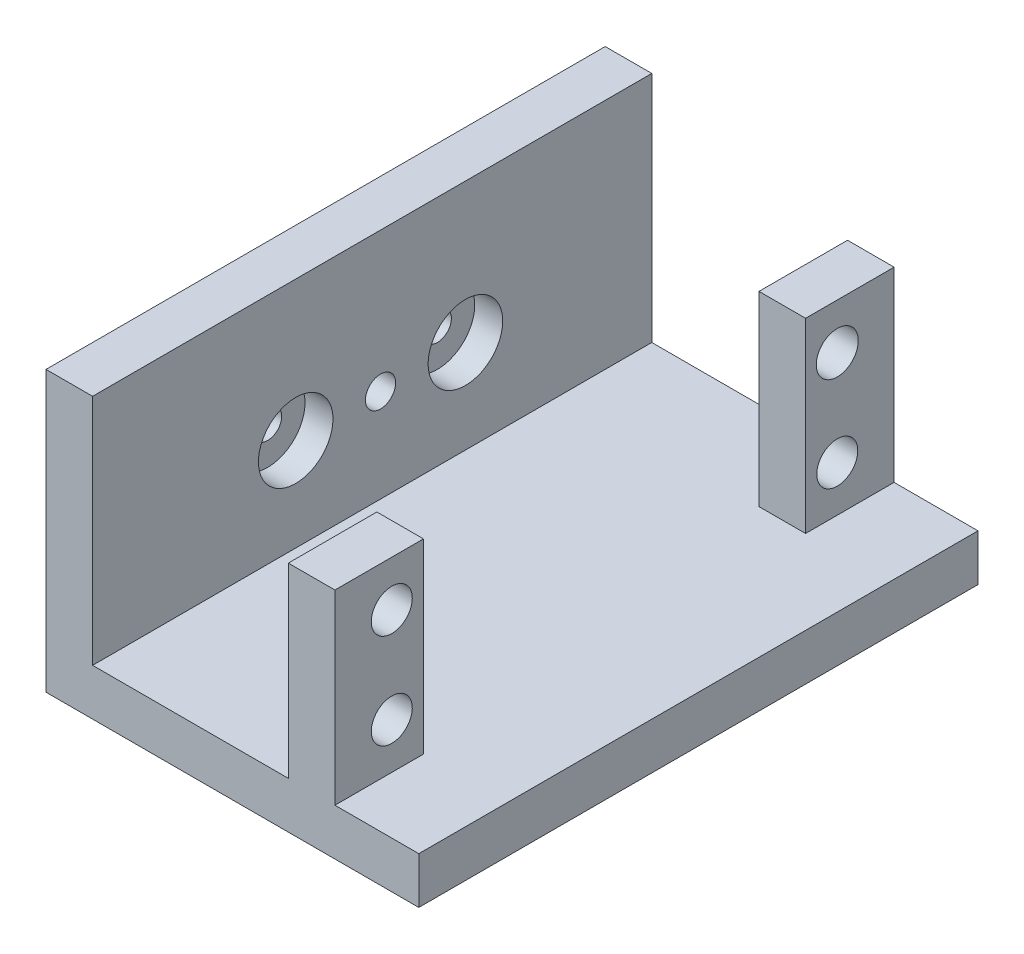
ISO-10303-21;
HEADER;
FILE_DESCRIPTION(('STEP AP214'),'2;1');
FILE_NAME('part.step','',(''),(''),'','','');
FILE_SCHEMA(('AUTOMOTIVE_DESIGN { 1 0 10303 214 1 1 1 1 }'));
ENDSEC;
DATA;
#1=APPLICATION_CONTEXT('core data for automotive mechanical design processes');
#2=APPLICATION_PROTOCOL_DEFINITION('international standard','automotive_design',2000,#1);
#3=PRODUCT_CONTEXT('',#1,'mechanical');
#4=PRODUCT('Part','Part','',(#3));
#5=PRODUCT_RELATED_PRODUCT_CATEGORY('part','',(#4));
#6=PRODUCT_DEFINITION_FORMATION('','',#4);
#7=PRODUCT_DEFINITION_CONTEXT('part definition',#1,'design');
#8=PRODUCT_DEFINITION('design','',#6,#7);
#9=PRODUCT_DEFINITION_SHAPE('','',#8);
#10=(LENGTH_UNIT() NAMED_UNIT(*) SI_UNIT(.MILLI.,.METRE.));
#11=(NAMED_UNIT(*) PLANE_ANGLE_UNIT() SI_UNIT($,.RADIAN.));
#12=(NAMED_UNIT(*) SI_UNIT($,.STERADIAN.) SOLID_ANGLE_UNIT());
#13=UNCERTAINTY_MEASURE_WITH_UNIT(LENGTH_MEASURE(1.E-05),#10,'distance_accuracy_value','');
#14=(GEOMETRIC_REPRESENTATION_CONTEXT(3) GLOBAL_UNCERTAINTY_ASSIGNED_CONTEXT((#13)) GLOBAL_UNIT_ASSIGNED_CONTEXT((#10,
#11,#12)) REPRESENTATION_CONTEXT('',''));
#15=CARTESIAN_POINT('',(0.,0.,0.));
#16=DIRECTION('',(0.,0.,1.));
#17=DIRECTION('',(1.,0.,0.));
#18=AXIS2_PLACEMENT_3D('',#15,#16,#17);
#19=CARTESIAN_POINT('',(10.,15.0000000000001,38.2089961386937));
#20=DIRECTION('',(-1.,0.,0.));
#21=DIRECTION('',(0.,-1.,0.));
#22=AXIS2_PLACEMENT_3D('',#19,#20,#21);
#23=CYLINDRICAL_SURFACE('',#22,1.5);
#24=CARTESIAN_POINT('',(0.,15.0000000000001,38.2089961386937));
#25=DIRECTION('',(-1.,0.,0.));
#26=DIRECTION('',(0.,-1.,0.));
#27=AXIS2_PLACEMENT_3D('',#24,#25,#26);
#28=CIRCLE('',#27,1.5);
#29=CARTESIAN_POINT('',(0.,13.5,38.2089961386937));
#30=VERTEX_POINT('',#29);
#31=EDGE_CURVE('E219',#30,#30,#28,.T.);
#32=ORIENTED_EDGE('',*,*,#31,.T.);
#33=EDGE_LOOP('',(#32));
#34=FACE_BOUND('',#33,.T.);
#35=CARTESIAN_POINT('',(2.,15.0000000000001,38.2089961386937));
#36=DIRECTION('',(1.,0.,0.));
#37=DIRECTION('',(0.,1.,0.));
#38=AXIS2_PLACEMENT_3D('',#35,#36,#37);
#39=CIRCLE('',#38,1.5);
#40=CARTESIAN_POINT('',(2.,16.5000000000001,38.2089961386937));
#41=VERTEX_POINT('',#40);
#42=EDGE_CURVE('E221',#41,#41,#39,.F.);
#43=ORIENTED_EDGE('',*,*,#42,.F.);
#44=EDGE_LOOP('',(#43));
#45=FACE_BOUND('',#44,.T.);
#46=ADVANCED_FACE('F33',(#34,#45),#23,.F.);
#47=CARTESIAN_POINT('',(10.,15.0000000000001,20.));
#48=DIRECTION('',(-1.,0.,0.));
#49=DIRECTION('',(0.,-1.,0.));
#50=AXIS2_PLACEMENT_3D('',#47,#48,#49);
#51=CYLINDRICAL_SURFACE('',#50,1.5);
#52=CARTESIAN_POINT('',(0.,15.0000000000001,20.));
#53=DIRECTION('',(-1.,0.,0.));
#54=DIRECTION('',(0.,-1.,0.));
#55=AXIS2_PLACEMENT_3D('',#52,#53,#54);
#56=CIRCLE('',#55,1.5);
#57=CARTESIAN_POINT('',(0.,13.5000000000001,20.));
#58=VERTEX_POINT('',#57);
#59=EDGE_CURVE('E243',#58,#58,#56,.T.);
#60=ORIENTED_EDGE('',*,*,#59,.T.);
#61=EDGE_LOOP('',(#60));
#62=FACE_BOUND('',#61,.T.);
#63=CARTESIAN_POINT('',(2.,15.0000000000001,20.));
#64=DIRECTION('',(1.,0.,0.));
#65=DIRECTION('',(0.,1.,0.));
#66=AXIS2_PLACEMENT_3D('',#63,#64,#65);
#67=CIRCLE('',#66,1.5);
#68=CARTESIAN_POINT('',(2.,16.5000000000001,20.));
#69=VERTEX_POINT('',#68);
#70=EDGE_CURVE('E217',#69,#69,#67,.F.);
#71=ORIENTED_EDGE('',*,*,#70,.F.);
#72=EDGE_LOOP('',(#71));
#73=FACE_BOUND('',#72,.T.);
#74=ADVANCED_FACE('F349',(#62,#73),#51,.F.);
#75=CARTESIAN_POINT('',(31.,25.,60.));
#76=DIRECTION('',(-1.,0.,0.));
#77=DIRECTION('',(0.,-1.,0.));
#78=AXIS2_PLACEMENT_3D('',#75,#76,#77);
#79=PLANE('',#78);
#80=CARTESIAN_POINT('',(31.,20.1,6.09999999999999));
#81=DIRECTION('',(1.,0.,0.));
#82=DIRECTION('',(0.,1.,0.));
#83=AXIS2_PLACEMENT_3D('',#80,#81,#82);
#84=CIRCLE('',#83,2.25352460703334);
#85=CARTESIAN_POINT('',(31.,22.3535246070334,6.09999999999999));
#86=VERTEX_POINT('',#85);
#87=EDGE_CURVE('E216',#86,#86,#84,.T.);
#88=ORIENTED_EDGE('',*,*,#87,.F.);
#89=EDGE_LOOP('',(#88));
#90=FACE_BOUND('',#89,.T.);
#91=CARTESIAN_POINT('',(31.,9.90000000000002,6.09999999999999));
#92=DIRECTION('',(1.,0.,0.));
#93=DIRECTION('',(0.,1.,0.));
#94=AXIS2_PLACEMENT_3D('',#91,#92,#93);
#95=CIRCLE('',#94,2.20000000000001);
#96=CARTESIAN_POINT('',(31.,12.1,6.09999999999999));
#97=VERTEX_POINT('',#96);
#98=EDGE_CURVE('E212',#97,#97,#95,.T.);
#99=ORIENTED_EDGE('',*,*,#98,.F.);
#100=EDGE_LOOP('',(#99));
#101=FACE_BOUND('',#100,.T.);
#102=DIRECTION('',(0.,0.,-1.));
#103=VECTOR('',#102,1.);
#104=CARTESIAN_POINT('',(31.,25.,60.));
#105=LINE('',#104,#103);
#106=CARTESIAN_POINT('',(31.,25.,9.5));
#107=VERTEX_POINT('',#106);
#108=CARTESIAN_POINT('',(31.,25.,0.));
#109=VERTEX_POINT('',#108);
#110=EDGE_CURVE('E187',#107,#109,#105,.T.);
#111=ORIENTED_EDGE('',*,*,#110,.F.);
#112=DIRECTION('',(0.,1.,0.));
#113=VECTOR('',#112,1.);
#114=CARTESIAN_POINT('',(31.,-36.3037528561268,9.5));
#115=LINE('',#114,#113);
#116=CARTESIAN_POINT('',(31.,5.,9.5));
#117=VERTEX_POINT('',#116);
#118=EDGE_CURVE('E158',#117,#107,#115,.T.);
#119=ORIENTED_EDGE('',*,*,#118,.F.);
#120=DIRECTION('',(0.,0.,-1.));
#121=VECTOR('',#120,1.);
#122=CARTESIAN_POINT('',(31.,5.,60.));
#123=LINE('',#122,#121);
#124=CARTESIAN_POINT('',(31.,5.,0.));
#125=VERTEX_POINT('',#124);
#126=EDGE_CURVE('E191',#117,#125,#123,.T.);
#127=ORIENTED_EDGE('',*,*,#126,.T.);
#128=DIRECTION('',(0.,1.,0.));
#129=VECTOR('',#128,1.);
#130=CARTESIAN_POINT('',(31.,25.,0.));
#131=LINE('',#130,#129);
#132=EDGE_CURVE('E165',#125,#109,#131,.T.);
#133=ORIENTED_EDGE('',*,*,#132,.T.);
#134=EDGE_LOOP('',(#111,#119,#127,#133));
#135=FACE_BOUND('',#134,.T.);
#136=ADVANCED_FACE('F325',(#90,#101,#135),#79,.F.);
#137=CARTESIAN_POINT('',(26.,25.,60.));
#138=DIRECTION('',(0.,-1.,0.));
#139=DIRECTION('',(0.,0.,-1.));
#140=AXIS2_PLACEMENT_3D('',#137,#138,#139);
#141=PLANE('',#140);
#142=DIRECTION('',(0.,0.,-1.));
#143=VECTOR('',#142,1.);
#144=CARTESIAN_POINT('',(26.,25.,60.));
#145=LINE('',#144,#143);
#146=CARTESIAN_POINT('',(26.,25.,9.5));
#147=VERTEX_POINT('',#146);
#148=CARTESIAN_POINT('',(26.,25.,0.));
#149=VERTEX_POINT('',#148);
#150=EDGE_CURVE('E183',#147,#149,#145,.T.);
#151=ORIENTED_EDGE('',*,*,#150,.F.);
#152=DIRECTION('',(-1.,0.,0.));
#153=VECTOR('',#152,1.);
#154=CARTESIAN_POINT('',(31.,25.,9.5));
#155=LINE('',#154,#153);
#156=EDGE_CURVE('E203',#107,#147,#155,.T.);
#157=ORIENTED_EDGE('',*,*,#156,.F.);
#158=ORIENTED_EDGE('',*,*,#110,.T.);
#159=DIRECTION('',(-1.,0.,0.));
#160=VECTOR('',#159,1.);
#161=CARTESIAN_POINT('',(26.,25.,0.));
#162=LINE('',#161,#160);
#163=EDGE_CURVE('E168',#109,#149,#162,.T.);
#164=ORIENTED_EDGE('',*,*,#163,.T.);
#165=EDGE_LOOP('',(#151,#157,#158,#164));
#166=FACE_BOUND('',#165,.T.);
#167=ADVANCED_FACE('F331',(#166),#141,.F.);
#168=CARTESIAN_POINT('',(26.,5.,60.));
#169=DIRECTION('',(1.,0.,0.));
#170=DIRECTION('',(0.,0.,-1.));
#171=AXIS2_PLACEMENT_3D('',#168,#169,#170);
#172=PLANE('',#171);
#173=CARTESIAN_POINT('',(26.,20.1,6.09999999999999));
#174=DIRECTION('',(1.,0.,0.));
#175=DIRECTION('',(0.,0.,-1.));
#176=AXIS2_PLACEMENT_3D('',#173,#174,#175);
#177=CIRCLE('',#176,2.25352460703334);
#178=CARTESIAN_POINT('',(26.,20.1,3.84647539296665));
#179=VERTEX_POINT('',#178);
#180=EDGE_CURVE('E213',#179,#179,#177,.T.);
#181=ORIENTED_EDGE('',*,*,#180,.T.);
#182=EDGE_LOOP('',(#181));
#183=FACE_BOUND('',#182,.T.);
#184=CARTESIAN_POINT('',(26.,9.90000000000002,6.09999999999999));
#185=DIRECTION('',(1.,0.,0.));
#186=DIRECTION('',(0.,0.,-1.));
#187=AXIS2_PLACEMENT_3D('',#184,#185,#186);
#188=CIRCLE('',#187,2.20000000000001);
#189=CARTESIAN_POINT('',(26.,9.90000000000002,3.89999999999999));
#190=VERTEX_POINT('',#189);
#191=EDGE_CURVE('E209',#190,#190,#188,.T.);
#192=ORIENTED_EDGE('',*,*,#191,.T.);
#193=EDGE_LOOP('',(#192));
#194=FACE_BOUND('',#193,.T.);
#195=DIRECTION('',(0.,0.,-1.));
#196=VECTOR('',#195,1.);
#197=CARTESIAN_POINT('',(26.,5.,60.));
#198=LINE('',#197,#196);
#199=CARTESIAN_POINT('',(26.,5.,9.5));
#200=VERTEX_POINT('',#199);
#201=CARTESIAN_POINT('',(26.,5.,0.));
#202=VERTEX_POINT('',#201);
#203=EDGE_CURVE('E145',#200,#202,#198,.T.);
#204=ORIENTED_EDGE('',*,*,#203,.F.);
#205=DIRECTION('',(0.,1.,0.));
#206=VECTOR('',#205,1.);
#207=CARTESIAN_POINT('',(26.,-36.3037528561268,9.5));
#208=LINE('',#207,#206);
#209=EDGE_CURVE('E260',#200,#147,#208,.T.);
#210=ORIENTED_EDGE('',*,*,#209,.T.);
#211=ORIENTED_EDGE('',*,*,#150,.T.);
#212=DIRECTION('',(0.,-1.,0.));
#213=VECTOR('',#212,1.);
#214=CARTESIAN_POINT('',(26.,5.,0.));
#215=LINE('',#214,#213);
#216=EDGE_CURVE('E171',#149,#202,#215,.T.);
#217=ORIENTED_EDGE('',*,*,#216,.T.);
#218=EDGE_LOOP('',(#204,#210,#211,#217));
#219=FACE_BOUND('',#218,.T.);
#220=ADVANCED_FACE('F335',(#183,#194,#219),#172,.F.);
#221=CARTESIAN_POINT('',(0.,30.,60.));
#222=DIRECTION('',(1.,0.,0.));
#223=DIRECTION('',(0.,1.,0.));
#224=AXIS2_PLACEMENT_3D('',#221,#222,#223);
#225=PLANE('',#224);
#226=CARTESIAN_POINT('',(0.,15.0000000000001,29.1044980693468));
#227=DIRECTION('',(1.,0.,0.));
#228=DIRECTION('',(0.,1.,0.));
#229=AXIS2_PLACEMENT_3D('',#226,#227,#228);
#230=CIRCLE('',#229,1.62131480529386);
#231=CARTESIAN_POINT('',(0.,16.6213148052939,29.1044980693468));
#232=VERTEX_POINT('',#231);
#233=EDGE_CURVE('E37',#232,#232,#230,.T.);
#234=ORIENTED_EDGE('',*,*,#233,.T.);
#235=EDGE_LOOP('',(#234));
#236=FACE_BOUND('',#235,.T.);
#237=ORIENTED_EDGE('',*,*,#31,.F.);
#238=EDGE_LOOP('',(#237));
#239=FACE_BOUND('',#238,.T.);
#240=ORIENTED_EDGE('',*,*,#59,.F.);
#241=EDGE_LOOP('',(#240));
#242=FACE_BOUND('',#241,.T.);
#243=DIRECTION('',(0.,-1.,0.));
#244=VECTOR('',#243,1.);
#245=CARTESIAN_POINT('',(0.,30.,0.));
#246=LINE('',#245,#244);
#247=CARTESIAN_POINT('',(0.,30.,0.));
#248=VERTEX_POINT('',#247);
#249=CARTESIAN_POINT('',(0.,0.,0.));
#250=VERTEX_POINT('',#249);
#251=EDGE_CURVE('E154',#248,#250,#246,.T.);
#252=ORIENTED_EDGE('',*,*,#251,.T.);
#253=DIRECTION('',(0.,0.,-1.));
#254=VECTOR('',#253,1.);
#255=CARTESIAN_POINT('',(0.,0.,60.));
#256=LINE('',#255,#254);
#257=CARTESIAN_POINT('',(0.,0.,60.));
#258=VERTEX_POINT('',#257);
#259=EDGE_CURVE('E11',#258,#250,#256,.T.);
#260=ORIENTED_EDGE('',*,*,#259,.F.);
#261=DIRECTION('',(0.,-1.,0.));
#262=VECTOR('',#261,1.);
#263=CARTESIAN_POINT('',(0.,30.,60.));
#264=LINE('',#263,#262);
#265=CARTESIAN_POINT('',(0.,30.,60.));
#266=VERTEX_POINT('',#265);
#267=EDGE_CURVE('E178',#266,#258,#264,.T.);
#268=ORIENTED_EDGE('',*,*,#267,.F.);
#269=DIRECTION('',(0.,0.,-1.));
#270=VECTOR('',#269,1.);
#271=CARTESIAN_POINT('',(0.,30.,60.));
#272=LINE('',#271,#270);
#273=EDGE_CURVE('E150',#266,#248,#272,.T.);
#274=ORIENTED_EDGE('',*,*,#273,.T.);
#275=EDGE_LOOP('',(#252,#260,#268,#274));
#276=FACE_BOUND('',#275,.T.);
#277=ADVANCED_FACE('F35',(#236,#239,#242,#276),#225,.F.);
#278=CARTESIAN_POINT('',(0.,0.,60.));
#279=DIRECTION('',(0.,1.,0.));
#280=DIRECTION('',(0.,0.,1.));
#281=AXIS2_PLACEMENT_3D('',#278,#279,#280);
#282=PLANE('',#281);
#283=DIRECTION('',(1.,0.,0.));
#284=VECTOR('',#283,1.);
#285=CARTESIAN_POINT('',(0.,0.,0.));
#286=LINE('',#285,#284);
#287=CARTESIAN_POINT('',(40.,0.,0.));
#288=VERTEX_POINT('',#287);
#289=EDGE_CURVE('E157',#250,#288,#286,.T.);
#290=ORIENTED_EDGE('',*,*,#289,.T.);
#291=DIRECTION('',(0.,0.,-1.));
#292=VECTOR('',#291,1.);
#293=CARTESIAN_POINT('',(40.,0.,60.));
#294=LINE('',#293,#292);
#295=CARTESIAN_POINT('',(40.,0.,60.));
#296=VERTEX_POINT('',#295);
#297=EDGE_CURVE('E42',#296,#288,#294,.T.);
#298=ORIENTED_EDGE('',*,*,#297,.F.);
#299=DIRECTION('',(1.,0.,0.));
#300=VECTOR('',#299,1.);
#301=CARTESIAN_POINT('',(0.,0.,60.));
#302=LINE('',#301,#300);
#303=EDGE_CURVE('E105',#258,#296,#302,.T.);
#304=ORIENTED_EDGE('',*,*,#303,.F.);
#305=ORIENTED_EDGE('',*,*,#259,.T.);
#306=EDGE_LOOP('',(#290,#298,#304,#305));
#307=FACE_BOUND('',#306,.T.);
#308=ADVANCED_FACE('F340',(#307),#282,.F.);
#309=CARTESIAN_POINT('',(40.,0.,60.));
#310=DIRECTION('',(-1.,0.,0.));
#311=DIRECTION('',(0.,0.,1.));
#312=AXIS2_PLACEMENT_3D('',#309,#310,#311);
#313=PLANE('',#312);
#314=DIRECTION('',(0.,1.,0.));
#315=VECTOR('',#314,1.);
#316=CARTESIAN_POINT('',(40.,0.,0.));
#317=LINE('',#316,#315);
#318=CARTESIAN_POINT('',(40.,5.,0.));
#319=VERTEX_POINT('',#318);
#320=EDGE_CURVE('E160',#288,#319,#317,.T.);
#321=ORIENTED_EDGE('',*,*,#320,.T.);
#322=DIRECTION('',(0.,0.,-1.));
#323=VECTOR('',#322,1.);
#324=CARTESIAN_POINT('',(40.,5.,60.));
#325=LINE('',#324,#323);
#326=CARTESIAN_POINT('',(40.,5.,60.));
#327=VERTEX_POINT('',#326);
#328=EDGE_CURVE('E195',#327,#319,#325,.T.);
#329=ORIENTED_EDGE('',*,*,#328,.F.);
#330=DIRECTION('',(0.,1.,0.));
#331=VECTOR('',#330,1.);
#332=CARTESIAN_POINT('',(40.,0.,60.));
#333=LINE('',#332,#331);
#334=EDGE_CURVE('E276',#296,#327,#333,.T.);
#335=ORIENTED_EDGE('',*,*,#334,.F.);
#336=ORIENTED_EDGE('',*,*,#297,.T.);
#337=EDGE_LOOP('',(#321,#329,#335,#336));
#338=FACE_BOUND('',#337,.T.);
#339=ADVANCED_FACE('F315',(#338),#313,.F.);
#340=CARTESIAN_POINT('',(31.,9.90000000000002,53.9));
#341=DIRECTION('',(1.,0.,0.));
#342=DIRECTION('',(0.,1.,0.));
#343=AXIS2_PLACEMENT_3D('',#340,#341,#342);
#344=CIRCLE('',#343,2.20000000000001);
#345=CARTESIAN_POINT('',(31.,12.1,53.9));
#346=VERTEX_POINT('',#345);
#347=EDGE_CURVE('E208',#346,#346,#344,.T.);
#348=ORIENTED_EDGE('',*,*,#347,.F.);
#349=EDGE_LOOP('',(#348));
#350=FACE_BOUND('',#349,.T.);
#351=CARTESIAN_POINT('',(31.,20.1,53.9));
#352=DIRECTION('',(1.,0.,0.));
#353=DIRECTION('',(0.,1.,0.));
#354=AXIS2_PLACEMENT_3D('',#351,#352,#353);
#355=CIRCLE('',#354,2.20000000000001);
#356=CARTESIAN_POINT('',(31.,22.3,53.9));
#357=VERTEX_POINT('',#356);
#358=EDGE_CURVE('E204',#357,#357,#355,.T.);
#359=ORIENTED_EDGE('',*,*,#358,.F.);
#360=EDGE_LOOP('',(#359));
#361=FACE_BOUND('',#360,.T.);
#362=CARTESIAN_POINT('',(31.,5.,60.));
#363=VERTEX_POINT('',#362);
#364=CARTESIAN_POINT('',(31.,5.,50.5));
#365=VERTEX_POINT('',#364);
#366=EDGE_CURVE('E192',#363,#365,#123,.T.);
#367=ORIENTED_EDGE('',*,*,#366,.T.);
#368=DIRECTION('',(0.,1.,0.));
#369=VECTOR('',#368,1.);
#370=CARTESIAN_POINT('',(31.,-36.3037528561268,50.5));
#371=LINE('',#370,#369);
#372=CARTESIAN_POINT('',(31.,25.,50.5));
#373=VERTEX_POINT('',#372);
#374=EDGE_CURVE('E264',#365,#373,#371,.T.);
#375=ORIENTED_EDGE('',*,*,#374,.T.);
#376=CARTESIAN_POINT('',(31.,25.,60.));
#377=VERTEX_POINT('',#376);
#378=EDGE_CURVE('E188',#377,#373,#105,.T.);
#379=ORIENTED_EDGE('',*,*,#378,.F.);
#380=DIRECTION('',(0.,1.,0.));
#381=VECTOR('',#380,1.);
#382=CARTESIAN_POINT('',(31.,25.,60.));
#383=LINE('',#382,#381);
#384=EDGE_CURVE('E280',#363,#377,#383,.T.);
#385=ORIENTED_EDGE('',*,*,#384,.F.);
#386=EDGE_LOOP('',(#367,#375,#379,#385));
#387=FACE_BOUND('',#386,.T.);
#388=ADVANCED_FACE('F309',(#350,#361,#387),#79,.F.);
#389=ORIENTED_EDGE('',*,*,#378,.T.);
#390=DIRECTION('',(1.,0.,0.));
#391=VECTOR('',#390,1.);
#392=CARTESIAN_POINT('',(31.,25.,50.5));
#393=LINE('',#392,#391);
#394=CARTESIAN_POINT('',(26.,25.,50.5));
#395=VERTEX_POINT('',#394);
#396=EDGE_CURVE('E254',#395,#373,#393,.T.);
#397=ORIENTED_EDGE('',*,*,#396,.F.);
#398=CARTESIAN_POINT('',(26.,25.,60.));
#399=VERTEX_POINT('',#398);
#400=EDGE_CURVE('E184',#399,#395,#145,.T.);
#401=ORIENTED_EDGE('',*,*,#400,.F.);
#402=DIRECTION('',(-1.,0.,0.));
#403=VECTOR('',#402,1.);
#404=CARTESIAN_POINT('',(26.,25.,60.));
#405=LINE('',#404,#403);
#406=EDGE_CURVE('E282',#377,#399,#405,.T.);
#407=ORIENTED_EDGE('',*,*,#406,.F.);
#408=EDGE_LOOP('',(#389,#397,#401,#407));
#409=FACE_BOUND('',#408,.T.);
#410=ADVANCED_FACE('F289',(#409),#141,.F.);
#411=CARTESIAN_POINT('',(26.,9.90000000000002,53.9));
#412=DIRECTION('',(1.,0.,0.));
#413=DIRECTION('',(0.,0.,-1.));
#414=AXIS2_PLACEMENT_3D('',#411,#412,#413);
#415=CIRCLE('',#414,2.20000000000001);
#416=CARTESIAN_POINT('',(26.,9.90000000000002,51.7));
#417=VERTEX_POINT('',#416);
#418=EDGE_CURVE('E205',#417,#417,#415,.T.);
#419=ORIENTED_EDGE('',*,*,#418,.T.);
#420=EDGE_LOOP('',(#419));
#421=FACE_BOUND('',#420,.T.);
#422=CARTESIAN_POINT('',(26.,20.1,53.9));
#423=DIRECTION('',(1.,0.,0.));
#424=DIRECTION('',(0.,0.,-1.));
#425=AXIS2_PLACEMENT_3D('',#422,#423,#424);
#426=CIRCLE('',#425,2.20000000000001);
#427=CARTESIAN_POINT('',(26.,20.1,51.7));
#428=VERTEX_POINT('',#427);
#429=EDGE_CURVE('E200',#428,#428,#426,.T.);
#430=ORIENTED_EDGE('',*,*,#429,.T.);
#431=EDGE_LOOP('',(#430));
#432=FACE_BOUND('',#431,.T.);
#433=ORIENTED_EDGE('',*,*,#400,.T.);
#434=DIRECTION('',(0.,1.,0.));
#435=VECTOR('',#434,1.);
#436=CARTESIAN_POINT('',(26.,-36.3037528561268,50.5));
#437=LINE('',#436,#435);
#438=CARTESIAN_POINT('',(26.,5.,50.5));
#439=VERTEX_POINT('',#438);
#440=EDGE_CURVE('E265',#439,#395,#437,.T.);
#441=ORIENTED_EDGE('',*,*,#440,.F.);
#442=CARTESIAN_POINT('',(26.,5.,60.));
#443=VERTEX_POINT('',#442);
#444=EDGE_CURVE('E181',#443,#439,#198,.T.);
#445=ORIENTED_EDGE('',*,*,#444,.F.);
#446=DIRECTION('',(0.,-1.,0.));
#447=VECTOR('',#446,1.);
#448=CARTESIAN_POINT('',(26.,5.,60.));
#449=LINE('',#448,#447);
#450=EDGE_CURVE('E134',#399,#443,#449,.T.);
#451=ORIENTED_EDGE('',*,*,#450,.F.);
#452=EDGE_LOOP('',(#433,#441,#445,#451));
#453=FACE_BOUND('',#452,.T.);
#454=ADVANCED_FACE('F293',(#421,#432,#453),#172,.F.);
#455=CARTESIAN_POINT('',(26.,5.,60.));
#456=DIRECTION('',(0.,-1.,0.));
#457=DIRECTION('',(1.,0.,0.));
#458=AXIS2_PLACEMENT_3D('',#455,#456,#457);
#459=PLANE('',#458);
#460=DIRECTION('',(-1.,0.,0.));
#461=VECTOR('',#460,1.);
#462=CARTESIAN_POINT('',(26.,5.,0.));
#463=LINE('',#462,#461);
#464=CARTESIAN_POINT('',(5.,4.99999999999999,0.));
#465=VERTEX_POINT('',#464);
#466=EDGE_CURVE('E142',#202,#465,#463,.T.);
#467=ORIENTED_EDGE('',*,*,#466,.T.);
#468=DIRECTION('',(0.,0.,-1.));
#469=VECTOR('',#468,1.);
#470=CARTESIAN_POINT('',(5.,4.99999999999999,60.));
#471=LINE('',#470,#469);
#472=CARTESIAN_POINT('',(5.,4.99999999999999,60.));
#473=VERTEX_POINT('',#472);
#474=EDGE_CURVE('E139',#473,#465,#471,.T.);
#475=ORIENTED_EDGE('',*,*,#474,.F.);
#476=DIRECTION('',(-1.,0.,0.));
#477=VECTOR('',#476,1.);
#478=CARTESIAN_POINT('',(26.,5.,60.));
#479=LINE('',#478,#477);
#480=EDGE_CURVE('E127',#443,#473,#479,.T.);
#481=ORIENTED_EDGE('',*,*,#480,.F.);
#482=ORIENTED_EDGE('',*,*,#444,.T.);
#483=DIRECTION('',(1.,0.,0.));
#484=VECTOR('',#483,1.);
#485=CARTESIAN_POINT('',(31.,5.,50.5));
#486=LINE('',#485,#484);
#487=EDGE_CURVE('E261',#439,#365,#486,.T.);
#488=ORIENTED_EDGE('',*,*,#487,.T.);
#489=ORIENTED_EDGE('',*,*,#366,.F.);
#490=DIRECTION('',(-1.,0.,0.));
#491=VECTOR('',#490,1.);
#492=CARTESIAN_POINT('',(40.,5.,60.));
#493=LINE('',#492,#491);
#494=EDGE_CURVE('E278',#327,#363,#493,.T.);
#495=ORIENTED_EDGE('',*,*,#494,.F.);
#496=ORIENTED_EDGE('',*,*,#328,.T.);
#497=DIRECTION('',(-1.,0.,0.));
#498=VECTOR('',#497,1.);
#499=CARTESIAN_POINT('',(40.,5.,0.));
#500=LINE('',#499,#498);
#501=EDGE_CURVE('E162',#319,#125,#500,.T.);
#502=ORIENTED_EDGE('',*,*,#501,.T.);
#503=ORIENTED_EDGE('',*,*,#126,.F.);
#504=DIRECTION('',(-1.,0.,0.));
#505=VECTOR('',#504,1.);
#506=CARTESIAN_POINT('',(31.,5.,9.5));
#507=LINE('',#506,#505);
#508=EDGE_CURVE('E50',#117,#200,#507,.T.);
#509=ORIENTED_EDGE('',*,*,#508,.T.);
#510=ORIENTED_EDGE('',*,*,#203,.T.);
#511=EDGE_LOOP('',(#467,#475,#481,#482,#488,#489,#495,#496,#502,#503,#509,#510));
#512=FACE_BOUND('',#511,.T.);
#513=ADVANCED_FACE('F140',(#512),#459,.F.);
#514=CARTESIAN_POINT('',(5.,4.99999999999999,60.));
#515=DIRECTION('',(-1.,0.,0.));
#516=DIRECTION('',(0.,-1.,0.));
#517=AXIS2_PLACEMENT_3D('',#514,#515,#516);
#518=PLANE('',#517);
#519=CARTESIAN_POINT('',(5.,15.0000000000001,29.1044980693468));
#520=DIRECTION('',(1.,0.,0.));
#521=DIRECTION('',(0.,1.,0.));
#522=AXIS2_PLACEMENT_3D('',#519,#520,#521);
#523=CIRCLE('',#522,1.62131480529386);
#524=CARTESIAN_POINT('',(5.,16.6213148052939,29.1044980693468));
#525=VERTEX_POINT('',#524);
#526=EDGE_CURVE('E235',#525,#525,#523,.T.);
#527=ORIENTED_EDGE('',*,*,#526,.F.);
#528=EDGE_LOOP('',(#527));
#529=FACE_BOUND('',#528,.T.);
#530=CARTESIAN_POINT('',(5.,15.0000000000001,38.2089961386937));
#531=DIRECTION('',(1.,0.,0.));
#532=DIRECTION('',(0.,1.,0.));
#533=AXIS2_PLACEMENT_3D('',#530,#531,#532);
#534=CIRCLE('',#533,4.);
#535=CARTESIAN_POINT('',(5.,19.0000000000001,38.2089961386937));
#536=VERTEX_POINT('',#535);
#537=EDGE_CURVE('E230',#536,#536,#534,.T.);
#538=ORIENTED_EDGE('',*,*,#537,.F.);
#539=EDGE_LOOP('',(#538));
#540=FACE_BOUND('',#539,.T.);
#541=CARTESIAN_POINT('',(5.,15.0000000000001,20.));
#542=DIRECTION('',(1.,0.,0.));
#543=DIRECTION('',(0.,1.,0.));
#544=AXIS2_PLACEMENT_3D('',#541,#542,#543);
#545=CIRCLE('',#544,4.);
#546=CARTESIAN_POINT('',(5.,19.0000000000001,20.));
#547=VERTEX_POINT('',#546);
#548=EDGE_CURVE('E223',#547,#547,#545,.T.);
#549=ORIENTED_EDGE('',*,*,#548,.F.);
#550=EDGE_LOOP('',(#549));
#551=FACE_BOUND('',#550,.T.);
#552=DIRECTION('',(0.,1.,0.));
#553=VECTOR('',#552,1.);
#554=CARTESIAN_POINT('',(5.,4.99999999999999,0.));
#555=LINE('',#554,#553);
#556=CARTESIAN_POINT('',(5.,30.,0.));
#557=VERTEX_POINT('',#556);
#558=EDGE_CURVE('E175',#465,#557,#555,.T.);
#559=ORIENTED_EDGE('',*,*,#558,.T.);
#560=DIRECTION('',(0.,0.,-1.));
#561=VECTOR('',#560,1.);
#562=CARTESIAN_POINT('',(5.,30.,60.));
#563=LINE('',#562,#561);
#564=CARTESIAN_POINT('',(5.,30.,60.));
#565=VERTEX_POINT('',#564);
#566=EDGE_CURVE('E146',#565,#557,#563,.T.);
#567=ORIENTED_EDGE('',*,*,#566,.F.);
#568=DIRECTION('',(0.,1.,0.));
#569=VECTOR('',#568,1.);
#570=CARTESIAN_POINT('',(5.,4.99999999999999,60.));
#571=LINE('',#570,#569);
#572=EDGE_CURVE('E131',#473,#565,#571,.T.);
#573=ORIENTED_EDGE('',*,*,#572,.F.);
#574=ORIENTED_EDGE('',*,*,#474,.T.);
#575=EDGE_LOOP('',(#559,#567,#573,#574));
#576=FACE_BOUND('',#575,.T.);
#577=ADVANCED_FACE('F148',(#529,#540,#551,#576),#518,.F.);
#578=CARTESIAN_POINT('',(5.,30.,60.));
#579=DIRECTION('',(0.,-1.,0.));
#580=DIRECTION('',(0.,0.,-1.));
#581=AXIS2_PLACEMENT_3D('',#578,#579,#580);
#582=PLANE('',#581);
#583=DIRECTION('',(-1.,0.,0.));
#584=VECTOR('',#583,1.);
#585=CARTESIAN_POINT('',(5.,30.,0.));
#586=LINE('',#585,#584);
#587=EDGE_CURVE('E97',#557,#248,#586,.T.);
#588=ORIENTED_EDGE('',*,*,#587,.T.);
#589=ORIENTED_EDGE('',*,*,#273,.F.);
#590=DIRECTION('',(-1.,0.,0.));
#591=VECTOR('',#590,1.);
#592=CARTESIAN_POINT('',(5.,30.,60.));
#593=LINE('',#592,#591);
#594=EDGE_CURVE('E59',#565,#266,#593,.T.);
#595=ORIENTED_EDGE('',*,*,#594,.F.);
#596=ORIENTED_EDGE('',*,*,#566,.T.);
#597=EDGE_LOOP('',(#588,#589,#595,#596));
#598=FACE_BOUND('',#597,.T.);
#599=ADVANCED_FACE('F336',(#598),#582,.F.);
#600=CARTESIAN_POINT('',(0.,0.,60.));
#601=DIRECTION('',(0.,0.,1.));
#602=DIRECTION('',(1.,0.,0.));
#603=AXIS2_PLACEMENT_3D('',#600,#601,#602);
#604=PLANE('',#603);
#605=ORIENTED_EDGE('',*,*,#267,.T.);
#606=ORIENTED_EDGE('',*,*,#303,.T.);
#607=ORIENTED_EDGE('',*,*,#334,.T.);
#608=ORIENTED_EDGE('',*,*,#494,.T.);
#609=ORIENTED_EDGE('',*,*,#384,.T.);
#610=ORIENTED_EDGE('',*,*,#406,.T.);
#611=ORIENTED_EDGE('',*,*,#450,.T.);
#612=ORIENTED_EDGE('',*,*,#480,.T.);
#613=ORIENTED_EDGE('',*,*,#572,.T.);
#614=ORIENTED_EDGE('',*,*,#594,.T.);
#615=EDGE_LOOP('',(#605,#606,#607,#608,#609,#610,#611,#612,#613,#614));
#616=FACE_BOUND('',#615,.T.);
#617=ADVANCED_FACE('F129',(#616),#604,.T.);
#618=CARTESIAN_POINT('',(0.,0.,0.));
#619=DIRECTION('',(0.,0.,1.));
#620=DIRECTION('',(1.,0.,0.));
#621=AXIS2_PLACEMENT_3D('',#618,#619,#620);
#622=PLANE('',#621);
#623=ORIENTED_EDGE('',*,*,#251,.F.);
#624=ORIENTED_EDGE('',*,*,#587,.F.);
#625=ORIENTED_EDGE('',*,*,#558,.F.);
#626=ORIENTED_EDGE('',*,*,#466,.F.);
#627=ORIENTED_EDGE('',*,*,#216,.F.);
#628=ORIENTED_EDGE('',*,*,#163,.F.);
#629=ORIENTED_EDGE('',*,*,#132,.F.);
#630=ORIENTED_EDGE('',*,*,#501,.F.);
#631=ORIENTED_EDGE('',*,*,#320,.F.);
#632=ORIENTED_EDGE('',*,*,#289,.F.);
#633=EDGE_LOOP('',(#623,#624,#625,#626,#627,#628,#629,#630,#631,#632));
#634=FACE_BOUND('',#633,.T.);
#635=ADVANCED_FACE('F319',(#634),#622,.F.);
#636=CARTESIAN_POINT('',(31.,-36.3037528561268,9.5));
#637=DIRECTION('',(0.,0.,-1.));
#638=DIRECTION('',(-1.,0.,0.));
#639=AXIS2_PLACEMENT_3D('',#636,#637,#638);
#640=PLANE('',#639);
#641=ORIENTED_EDGE('',*,*,#118,.T.);
#642=ORIENTED_EDGE('',*,*,#156,.T.);
#643=ORIENTED_EDGE('',*,*,#209,.F.);
#644=ORIENTED_EDGE('',*,*,#508,.F.);
#645=EDGE_LOOP('',(#641,#642,#643,#644));
#646=FACE_BOUND('',#645,.T.);
#647=ADVANCED_FACE('F328',(#646),#640,.F.);
#648=CARTESIAN_POINT('',(31.,-36.3037528561268,50.5));
#649=DIRECTION('',(0.,0.,1.));
#650=DIRECTION('',(1.,0.,0.));
#651=AXIS2_PLACEMENT_3D('',#648,#649,#650);
#652=PLANE('',#651);
#653=ORIENTED_EDGE('',*,*,#440,.T.);
#654=ORIENTED_EDGE('',*,*,#396,.T.);
#655=ORIENTED_EDGE('',*,*,#374,.F.);
#656=ORIENTED_EDGE('',*,*,#487,.F.);
#657=EDGE_LOOP('',(#653,#654,#655,#656));
#658=FACE_BOUND('',#657,.T.);
#659=ADVANCED_FACE('F307',(#658),#652,.F.);
#660=CARTESIAN_POINT('',(21.,20.1,53.9));
#661=DIRECTION('',(1.,0.,0.));
#662=DIRECTION('',(0.,1.,0.));
#663=AXIS2_PLACEMENT_3D('',#660,#661,#662);
#664=CYLINDRICAL_SURFACE('',#663,2.20000000000001);
#665=ORIENTED_EDGE('',*,*,#358,.T.);
#666=EDGE_LOOP('',(#665));
#667=FACE_BOUND('',#666,.T.);
#668=ORIENTED_EDGE('',*,*,#429,.F.);
#669=EDGE_LOOP('',(#668));
#670=FACE_BOUND('',#669,.T.);
#671=ADVANCED_FACE('F374',(#667,#670),#664,.F.);
#672=CARTESIAN_POINT('',(21.,9.90000000000002,53.9));
#673=DIRECTION('',(1.,0.,0.));
#674=DIRECTION('',(0.,1.,0.));
#675=AXIS2_PLACEMENT_3D('',#672,#673,#674);
#676=CYLINDRICAL_SURFACE('',#675,2.20000000000001);
#677=ORIENTED_EDGE('',*,*,#347,.T.);
#678=EDGE_LOOP('',(#677));
#679=FACE_BOUND('',#678,.T.);
#680=ORIENTED_EDGE('',*,*,#418,.F.);
#681=EDGE_LOOP('',(#680));
#682=FACE_BOUND('',#681,.T.);
#683=ADVANCED_FACE('F370',(#679,#682),#676,.F.);
#684=CARTESIAN_POINT('',(21.,9.90000000000002,6.09999999999999));
#685=DIRECTION('',(1.,0.,0.));
#686=DIRECTION('',(0.,1.,0.));
#687=AXIS2_PLACEMENT_3D('',#684,#685,#686);
#688=CYLINDRICAL_SURFACE('',#687,2.20000000000001);
#689=ORIENTED_EDGE('',*,*,#98,.T.);
#690=EDGE_LOOP('',(#689));
#691=FACE_BOUND('',#690,.T.);
#692=ORIENTED_EDGE('',*,*,#191,.F.);
#693=EDGE_LOOP('',(#692));
#694=FACE_BOUND('',#693,.T.);
#695=ADVANCED_FACE('F366',(#691,#694),#688,.F.);
#696=CARTESIAN_POINT('',(21.,20.1,6.09999999999999));
#697=DIRECTION('',(1.,0.,0.));
#698=DIRECTION('',(0.,1.,0.));
#699=AXIS2_PLACEMENT_3D('',#696,#697,#698);
#700=CYLINDRICAL_SURFACE('',#699,2.25352460703334);
#701=ORIENTED_EDGE('',*,*,#87,.T.);
#702=EDGE_LOOP('',(#701));
#703=FACE_BOUND('',#702,.T.);
#704=ORIENTED_EDGE('',*,*,#180,.F.);
#705=EDGE_LOOP('',(#704));
#706=FACE_BOUND('',#705,.T.);
#707=ADVANCED_FACE('F362',(#703,#706),#700,.F.);
#708=CARTESIAN_POINT('',(2.,15.0000000000001,20.));
#709=DIRECTION('',(1.,0.,0.));
#710=DIRECTION('',(0.,1.,0.));
#711=AXIS2_PLACEMENT_3D('',#708,#709,#710);
#712=PLANE('',#711);
#713=CARTESIAN_POINT('',(2.,15.0000000000001,20.));
#714=DIRECTION('',(1.,0.,0.));
#715=DIRECTION('',(0.,1.,0.));
#716=AXIS2_PLACEMENT_3D('',#713,#714,#715);
#717=CIRCLE('',#716,4.);
#718=CARTESIAN_POINT('',(2.,19.0000000000001,20.));
#719=VERTEX_POINT('',#718);
#720=EDGE_CURVE('E220',#719,#719,#717,.T.);
#721=ORIENTED_EDGE('',*,*,#720,.T.);
#722=EDGE_LOOP('',(#721));
#723=FACE_BOUND('',#722,.T.);
#724=ORIENTED_EDGE('',*,*,#70,.T.);
#725=EDGE_LOOP('',(#724));
#726=FACE_BOUND('',#725,.T.);
#727=ADVANCED_FACE('F365',(#723,#726),#712,.T.);
#728=CARTESIAN_POINT('',(2.,15.0000000000001,20.));
#729=DIRECTION('',(1.,0.,0.));
#730=DIRECTION('',(0.,1.,0.));
#731=AXIS2_PLACEMENT_3D('',#728,#729,#730);
#732=CYLINDRICAL_SURFACE('',#731,4.);
#733=ORIENTED_EDGE('',*,*,#720,.F.);
#734=EDGE_LOOP('',(#733));
#735=FACE_BOUND('',#734,.T.);
#736=ORIENTED_EDGE('',*,*,#548,.T.);
#737=EDGE_LOOP('',(#736));
#738=FACE_BOUND('',#737,.T.);
#739=ADVANCED_FACE('F359',(#735,#738),#732,.F.);
#740=CARTESIAN_POINT('',(2.,15.0000000000001,38.2089961386937));
#741=DIRECTION('',(1.,0.,0.));
#742=DIRECTION('',(0.,1.,0.));
#743=AXIS2_PLACEMENT_3D('',#740,#741,#742);
#744=PLANE('',#743);
#745=CARTESIAN_POINT('',(2.,15.0000000000001,38.2089961386937));
#746=DIRECTION('',(1.,0.,0.));
#747=DIRECTION('',(0.,1.,0.));
#748=AXIS2_PLACEMENT_3D('',#745,#746,#747);
#749=CIRCLE('',#748,4.);
#750=CARTESIAN_POINT('',(2.,19.0000000000001,38.2089961386937));
#751=VERTEX_POINT('',#750);
#752=EDGE_CURVE('E224',#751,#751,#749,.T.);
#753=ORIENTED_EDGE('',*,*,#752,.T.);
#754=EDGE_LOOP('',(#753));
#755=FACE_BOUND('',#754,.T.);
#756=ORIENTED_EDGE('',*,*,#42,.T.);
#757=EDGE_LOOP('',(#756));
#758=FACE_BOUND('',#757,.T.);
#759=ADVANCED_FACE('F452',(#755,#758),#744,.T.);
#760=CARTESIAN_POINT('',(2.,15.0000000000001,38.2089961386937));
#761=DIRECTION('',(1.,0.,0.));
#762=DIRECTION('',(0.,1.,0.));
#763=AXIS2_PLACEMENT_3D('',#760,#761,#762);
#764=CYLINDRICAL_SURFACE('',#763,4.);
#765=ORIENTED_EDGE('',*,*,#752,.F.);
#766=EDGE_LOOP('',(#765));
#767=FACE_BOUND('',#766,.T.);
#768=ORIENTED_EDGE('',*,*,#537,.T.);
#769=EDGE_LOOP('',(#768));
#770=FACE_BOUND('',#769,.T.);
#771=ADVANCED_FACE('F435',(#767,#770),#764,.F.);
#772=CARTESIAN_POINT('',(2.,15.0000000000001,29.1044980693468));
#773=DIRECTION('',(1.,0.,0.));
#774=DIRECTION('',(0.,1.,0.));
#775=AXIS2_PLACEMENT_3D('',#772,#773,#774);
#776=CYLINDRICAL_SURFACE('',#775,1.62131480529386);
#777=ORIENTED_EDGE('',*,*,#526,.T.);
#778=EDGE_LOOP('',(#777));
#779=FACE_BOUND('',#778,.T.);
#780=ORIENTED_EDGE('',*,*,#233,.F.);
#781=EDGE_LOOP('',(#780));
#782=FACE_BOUND('',#781,.T.);
#783=ADVANCED_FACE('F440',(#779,#782),#776,.F.);
#784=CLOSED_SHELL('',(#46,#74,#136,#167,#220,#277,#308,#339,#388,#410,#454,#513,#577,#599,#617,
#635,#647,#659,#671,#683,#695,#707,#727,#739,#759,#771,#783));
#785=MANIFOLD_SOLID_BREP('B2',#784);
#786=ADVANCED_BREP_SHAPE_REPRESENTATION('',(#18,#785),#14);
#787=SHAPE_DEFINITION_REPRESENTATION(#9,#786);
ENDSEC;
END-ISO-10303-21;
